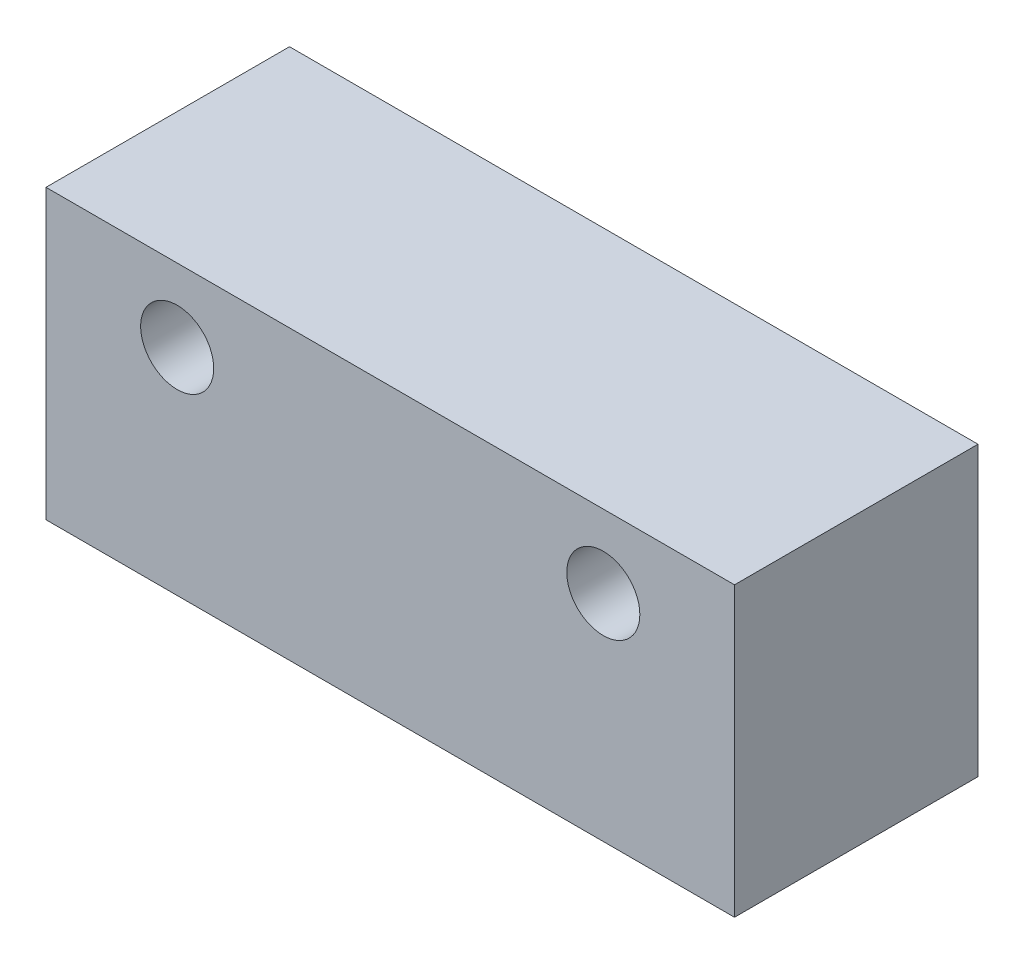
ISO-10303-21;
HEADER;
FILE_DESCRIPTION(('STEP AP214'),'2;1');
FILE_NAME('part.step','',(''),(''),'','','');
FILE_SCHEMA(('AUTOMOTIVE_DESIGN { 1 0 10303 214 1 1 1 1 }'));
ENDSEC;
DATA;
#1=APPLICATION_CONTEXT('core data for automotive mechanical design processes');
#2=APPLICATION_PROTOCOL_DEFINITION('international standard','automotive_design',2000,#1);
#3=PRODUCT_CONTEXT('',#1,'mechanical');
#4=PRODUCT('Part','Part','',(#3));
#5=PRODUCT_RELATED_PRODUCT_CATEGORY('part','',(#4));
#6=PRODUCT_DEFINITION_FORMATION('','',#4);
#7=PRODUCT_DEFINITION_CONTEXT('part definition',#1,'design');
#8=PRODUCT_DEFINITION('design','',#6,#7);
#9=PRODUCT_DEFINITION_SHAPE('','',#8);
#10=(LENGTH_UNIT() NAMED_UNIT(*) SI_UNIT(.MILLI.,.METRE.));
#11=(NAMED_UNIT(*) PLANE_ANGLE_UNIT() SI_UNIT($,.RADIAN.));
#12=(NAMED_UNIT(*) SI_UNIT($,.STERADIAN.) SOLID_ANGLE_UNIT());
#13=UNCERTAINTY_MEASURE_WITH_UNIT(LENGTH_MEASURE(1.E-05),#10,'distance_accuracy_value','');
#14=(GEOMETRIC_REPRESENTATION_CONTEXT(3) GLOBAL_UNCERTAINTY_ASSIGNED_CONTEXT((#13)) GLOBAL_UNIT_ASSIGNED_CONTEXT((#10,
#11,#12)) REPRESENTATION_CONTEXT('',''));
#15=CARTESIAN_POINT('',(0.,0.,0.));
#16=DIRECTION('',(0.,0.,1.));
#17=DIRECTION('',(1.,0.,0.));
#18=AXIS2_PLACEMENT_3D('',#15,#16,#17);
#19=CARTESIAN_POINT('',(-28.275,11.825,20.));
#20=DIRECTION('',(0.,1.,0.));
#21=DIRECTION('',(0.,0.,1.));
#22=AXIS2_PLACEMENT_3D('',#19,#20,#21);
#23=PLANE('',#22);
#24=DIRECTION('',(1.,0.,0.));
#25=VECTOR('',#24,1.);
#26=CARTESIAN_POINT('',(-28.275,11.825,0.));
#27=LINE('',#26,#25);
#28=CARTESIAN_POINT('',(-28.275,11.825,0.));
#29=VERTEX_POINT('',#28);
#30=CARTESIAN_POINT('',(28.275,11.825,0.));
#31=VERTEX_POINT('',#30);
#32=EDGE_CURVE('E103',#29,#31,#27,.T.);
#33=ORIENTED_EDGE('',*,*,#32,.F.);
#34=DIRECTION('',(0.,0.,-1.));
#35=VECTOR('',#34,1.);
#36=CARTESIAN_POINT('',(-28.275,11.825,20.));
#37=LINE('',#36,#35);
#38=CARTESIAN_POINT('',(-28.275,11.825,20.));
#39=VERTEX_POINT('',#38);
#40=EDGE_CURVE('E11',#39,#29,#37,.T.);
#41=ORIENTED_EDGE('',*,*,#40,.F.);
#42=DIRECTION('',(1.,0.,0.));
#43=VECTOR('',#42,1.);
#44=CARTESIAN_POINT('',(-28.275,11.825,20.));
#45=LINE('',#44,#43);
#46=CARTESIAN_POINT('',(28.275,11.825,20.));
#47=VERTEX_POINT('',#46);
#48=EDGE_CURVE('E97',#39,#47,#45,.T.);
#49=ORIENTED_EDGE('',*,*,#48,.T.);
#50=DIRECTION('',(0.,0.,-1.));
#51=VECTOR('',#50,1.);
#52=CARTESIAN_POINT('',(28.275,11.825,20.));
#53=LINE('',#52,#51);
#54=EDGE_CURVE('E40',#47,#31,#53,.T.);
#55=ORIENTED_EDGE('',*,*,#54,.T.);
#56=EDGE_LOOP('',(#33,#41,#49,#55));
#57=FACE_BOUND('',#56,.T.);
#58=ADVANCED_FACE('F37',(#57),#23,.T.);
#59=CARTESIAN_POINT('',(-28.275,11.825,20.));
#60=DIRECTION('',(1.,0.,0.));
#61=DIRECTION('',(0.,1.,0.));
#62=AXIS2_PLACEMENT_3D('',#59,#60,#61);
#63=PLANE('',#62);
#64=DIRECTION('',(0.,-1.,0.));
#65=VECTOR('',#64,1.);
#66=CARTESIAN_POINT('',(-28.275,11.825,0.));
#67=LINE('',#66,#65);
#68=CARTESIAN_POINT('',(-28.275,-11.825,0.));
#69=VERTEX_POINT('',#68);
#70=EDGE_CURVE('E70',#29,#69,#67,.T.);
#71=ORIENTED_EDGE('',*,*,#70,.T.);
#72=DIRECTION('',(0.,0.,-1.));
#73=VECTOR('',#72,1.);
#74=CARTESIAN_POINT('',(-28.275,-11.825,20.));
#75=LINE('',#74,#73);
#76=CARTESIAN_POINT('',(-28.275,-11.825,20.));
#77=VERTEX_POINT('',#76);
#78=EDGE_CURVE('E46',#77,#69,#75,.T.);
#79=ORIENTED_EDGE('',*,*,#78,.F.);
#80=DIRECTION('',(0.,-1.,0.));
#81=VECTOR('',#80,1.);
#82=CARTESIAN_POINT('',(-28.275,11.825,20.));
#83=LINE('',#82,#81);
#84=EDGE_CURVE('E87',#39,#77,#83,.T.);
#85=ORIENTED_EDGE('',*,*,#84,.F.);
#86=ORIENTED_EDGE('',*,*,#40,.T.);
#87=EDGE_LOOP('',(#71,#79,#85,#86));
#88=FACE_BOUND('',#87,.T.);
#89=ADVANCED_FACE('F114',(#88),#63,.F.);
#90=CARTESIAN_POINT('',(-28.275,-11.825,20.));
#91=DIRECTION('',(0.,1.,0.));
#92=DIRECTION('',(0.,0.,1.));
#93=AXIS2_PLACEMENT_3D('',#90,#91,#92);
#94=PLANE('',#93);
#95=DIRECTION('',(1.,0.,0.));
#96=VECTOR('',#95,1.);
#97=CARTESIAN_POINT('',(-28.275,-11.825,0.));
#98=LINE('',#97,#96);
#99=CARTESIAN_POINT('',(28.275,-11.825,0.));
#100=VERTEX_POINT('',#99);
#101=EDGE_CURVE('E94',#69,#100,#98,.T.);
#102=ORIENTED_EDGE('',*,*,#101,.T.);
#103=DIRECTION('',(0.,0.,-1.));
#104=VECTOR('',#103,1.);
#105=CARTESIAN_POINT('',(28.275,-11.825,20.));
#106=LINE('',#105,#104);
#107=CARTESIAN_POINT('',(28.275,-11.825,20.));
#108=VERTEX_POINT('',#107);
#109=EDGE_CURVE('E91',#108,#100,#106,.T.);
#110=ORIENTED_EDGE('',*,*,#109,.F.);
#111=DIRECTION('',(1.,0.,0.));
#112=VECTOR('',#111,1.);
#113=CARTESIAN_POINT('',(-28.275,-11.825,20.));
#114=LINE('',#113,#112);
#115=EDGE_CURVE('E82',#77,#108,#114,.T.);
#116=ORIENTED_EDGE('',*,*,#115,.F.);
#117=ORIENTED_EDGE('',*,*,#78,.T.);
#118=EDGE_LOOP('',(#102,#110,#116,#117));
#119=FACE_BOUND('',#118,.T.);
#120=ADVANCED_FACE('F92',(#119),#94,.F.);
#121=CARTESIAN_POINT('',(28.275,11.825,20.));
#122=DIRECTION('',(1.,0.,0.));
#123=DIRECTION('',(0.,1.,0.));
#124=AXIS2_PLACEMENT_3D('',#121,#122,#123);
#125=PLANE('',#124);
#126=DIRECTION('',(0.,-1.,0.));
#127=VECTOR('',#126,1.);
#128=CARTESIAN_POINT('',(28.275,11.825,0.));
#129=LINE('',#128,#127);
#130=EDGE_CURVE('E106',#31,#100,#129,.T.);
#131=ORIENTED_EDGE('',*,*,#130,.F.);
#132=ORIENTED_EDGE('',*,*,#54,.F.);
#133=DIRECTION('',(0.,-1.,0.));
#134=VECTOR('',#133,1.);
#135=CARTESIAN_POINT('',(28.275,11.825,20.));
#136=LINE('',#135,#134);
#137=EDGE_CURVE('E86',#47,#108,#136,.T.);
#138=ORIENTED_EDGE('',*,*,#137,.T.);
#139=ORIENTED_EDGE('',*,*,#109,.T.);
#140=EDGE_LOOP('',(#131,#132,#138,#139));
#141=FACE_BOUND('',#140,.T.);
#142=ADVANCED_FACE('F96',(#141),#125,.T.);
#143=CARTESIAN_POINT('',(0.,0.,20.));
#144=DIRECTION('',(0.,0.,-1.));
#145=DIRECTION('',(-1.,0.,0.));
#146=AXIS2_PLACEMENT_3D('',#143,#144,#145);
#147=PLANE('',#146);
#148=CARTESIAN_POINT('',(-17.5,5.825,20.));
#149=DIRECTION('',(0.,0.,1.));
#150=DIRECTION('',(1.,0.,0.));
#151=AXIS2_PLACEMENT_3D('',#148,#149,#150);
#152=CIRCLE('',#151,2.99999999999999);
#153=CARTESIAN_POINT('',(-14.5,5.825,20.));
#154=VERTEX_POINT('',#153);
#155=EDGE_CURVE('E155',#154,#154,#152,.T.);
#156=ORIENTED_EDGE('',*,*,#155,.F.);
#157=EDGE_LOOP('',(#156));
#158=FACE_BOUND('',#157,.T.);
#159=CARTESIAN_POINT('',(17.5,5.825,20.));
#160=DIRECTION('',(0.,0.,1.));
#161=DIRECTION('',(1.,0.,0.));
#162=AXIS2_PLACEMENT_3D('',#159,#160,#161);
#163=CIRCLE('',#162,2.99999999999999);
#164=CARTESIAN_POINT('',(20.5,5.825,20.));
#165=VERTEX_POINT('',#164);
#166=EDGE_CURVE('E162',#165,#165,#163,.T.);
#167=ORIENTED_EDGE('',*,*,#166,.F.);
#168=EDGE_LOOP('',(#167));
#169=FACE_BOUND('',#168,.T.);
#170=ORIENTED_EDGE('',*,*,#48,.F.);
#171=ORIENTED_EDGE('',*,*,#84,.T.);
#172=ORIENTED_EDGE('',*,*,#115,.T.);
#173=ORIENTED_EDGE('',*,*,#137,.F.);
#174=EDGE_LOOP('',(#170,#171,#172,#173));
#175=FACE_BOUND('',#174,.T.);
#176=ADVANCED_FACE('F85',(#158,#169,#175),#147,.F.);
#177=CARTESIAN_POINT('',(0.,0.,0.));
#178=DIRECTION('',(0.,0.,-1.));
#179=DIRECTION('',(-1.,0.,0.));
#180=AXIS2_PLACEMENT_3D('',#177,#178,#179);
#181=PLANE('',#180);
#182=ORIENTED_EDGE('',*,*,#32,.T.);
#183=ORIENTED_EDGE('',*,*,#130,.T.);
#184=ORIENTED_EDGE('',*,*,#101,.F.);
#185=ORIENTED_EDGE('',*,*,#70,.F.);
#186=EDGE_LOOP('',(#182,#183,#184,#185));
#187=FACE_BOUND('',#186,.T.);
#188=ADVANCED_FACE('F112',(#187),#181,.T.);
#189=CARTESIAN_POINT('',(17.5,5.825,8.));
#190=DIRECTION('',(0.,0.,1.));
#191=DIRECTION('',(1.,0.,0.));
#192=AXIS2_PLACEMENT_3D('',#189,#190,#191);
#193=CYLINDRICAL_SURFACE('',#192,2.99999999999999);
#194=CARTESIAN_POINT('',(17.5,5.825,8.));
#195=DIRECTION('',(0.,0.,1.));
#196=DIRECTION('',(1.,0.,0.));
#197=AXIS2_PLACEMENT_3D('',#194,#195,#196);
#198=CIRCLE('',#197,2.99999999999999);
#199=CARTESIAN_POINT('',(20.5,5.825,8.));
#200=VERTEX_POINT('',#199);
#201=EDGE_CURVE('E158',#200,#200,#198,.T.);
#202=ORIENTED_EDGE('',*,*,#201,.F.);
#203=EDGE_LOOP('',(#202));
#204=FACE_BOUND('',#203,.T.);
#205=ORIENTED_EDGE('',*,*,#166,.T.);
#206=EDGE_LOOP('',(#205));
#207=FACE_BOUND('',#206,.T.);
#208=ADVANCED_FACE('F133',(#204,#207),#193,.F.);
#209=CARTESIAN_POINT('',(0.,0.,8.));
#210=DIRECTION('',(0.,0.,1.));
#211=DIRECTION('',(1.,0.,0.));
#212=AXIS2_PLACEMENT_3D('',#209,#210,#211);
#213=PLANE('',#212);
#214=ORIENTED_EDGE('',*,*,#201,.T.);
#215=EDGE_LOOP('',(#214));
#216=FACE_BOUND('',#215,.T.);
#217=ADVANCED_FACE('F139',(#216),#213,.T.);
#218=CARTESIAN_POINT('',(-17.5,5.825,8.));
#219=DIRECTION('',(0.,0.,1.));
#220=DIRECTION('',(1.,0.,0.));
#221=AXIS2_PLACEMENT_3D('',#218,#219,#220);
#222=CYLINDRICAL_SURFACE('',#221,2.99999999999999);
#223=CARTESIAN_POINT('',(-17.5,5.825,8.));
#224=DIRECTION('',(0.,0.,1.));
#225=DIRECTION('',(1.,0.,0.));
#226=AXIS2_PLACEMENT_3D('',#223,#224,#225);
#227=CIRCLE('',#226,2.99999999999999);
#228=CARTESIAN_POINT('',(-14.5,5.825,8.));
#229=VERTEX_POINT('',#228);
#230=EDGE_CURVE('E107',#229,#229,#227,.T.);
#231=ORIENTED_EDGE('',*,*,#230,.F.);
#232=EDGE_LOOP('',(#231));
#233=FACE_BOUND('',#232,.T.);
#234=ORIENTED_EDGE('',*,*,#155,.T.);
#235=EDGE_LOOP('',(#234));
#236=FACE_BOUND('',#235,.T.);
#237=ADVANCED_FACE('F143',(#233,#236),#222,.F.);
#238=CARTESIAN_POINT('',(0.,0.,8.));
#239=DIRECTION('',(0.,0.,1.));
#240=DIRECTION('',(1.,0.,0.));
#241=AXIS2_PLACEMENT_3D('',#238,#239,#240);
#242=PLANE('',#241);
#243=ORIENTED_EDGE('',*,*,#230,.T.);
#244=EDGE_LOOP('',(#243));
#245=FACE_BOUND('',#244,.T.);
#246=ADVANCED_FACE('F147',(#245),#242,.T.);
#247=CLOSED_SHELL('',(#58,#89,#120,#142,#176,#188,#208,#217,#237,#246));
#248=MANIFOLD_SOLID_BREP('B2',#247);
#249=ADVANCED_BREP_SHAPE_REPRESENTATION('',(#18,#248),#14);
#250=SHAPE_DEFINITION_REPRESENTATION(#9,#249);
ENDSEC;
END-ISO-10303-21;
